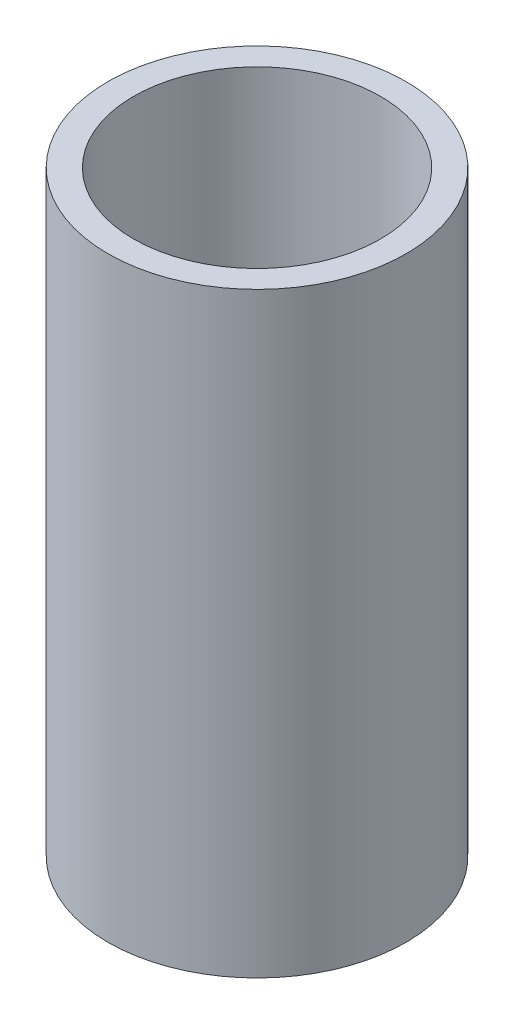
ISO-10303-21;
HEADER;
FILE_DESCRIPTION(('STEP AP214'),'2;1');
FILE_NAME('part.step','',(''),(''),'','','');
FILE_SCHEMA(('AUTOMOTIVE_DESIGN { 1 0 10303 214 1 1 1 1 }'));
ENDSEC;
DATA;
#1=APPLICATION_CONTEXT('core data for automotive mechanical design processes');
#2=APPLICATION_PROTOCOL_DEFINITION('international standard','automotive_design',2000,#1);
#3=PRODUCT_CONTEXT('',#1,'mechanical');
#4=PRODUCT('Part','Part','',(#3));
#5=PRODUCT_RELATED_PRODUCT_CATEGORY('part','',(#4));
#6=PRODUCT_DEFINITION_FORMATION('','',#4);
#7=PRODUCT_DEFINITION_CONTEXT('part definition',#1,'design');
#8=PRODUCT_DEFINITION('design','',#6,#7);
#9=PRODUCT_DEFINITION_SHAPE('','',#8);
#10=(LENGTH_UNIT() NAMED_UNIT(*) SI_UNIT(.MILLI.,.METRE.));
#11=(NAMED_UNIT(*) PLANE_ANGLE_UNIT() SI_UNIT($,.RADIAN.));
#12=(NAMED_UNIT(*) SI_UNIT($,.STERADIAN.) SOLID_ANGLE_UNIT());
#13=UNCERTAINTY_MEASURE_WITH_UNIT(LENGTH_MEASURE(1.E-05),#10,'distance_accuracy_value','');
#14=(GEOMETRIC_REPRESENTATION_CONTEXT(3) GLOBAL_UNCERTAINTY_ASSIGNED_CONTEXT((#13)) GLOBAL_UNIT_ASSIGNED_CONTEXT((#10,
#11,#12)) REPRESENTATION_CONTEXT('',''));
#15=CARTESIAN_POINT('',(0.,0.,0.));
#16=DIRECTION('',(0.,0.,1.));
#17=DIRECTION('',(1.,0.,0.));
#18=AXIS2_PLACEMENT_3D('',#15,#16,#17);
#19=CARTESIAN_POINT('',(-300.,-10.,0.));
#20=DIRECTION('',(0.,1.,0.));
#21=DIRECTION('',(0.,0.,1.));
#22=AXIS2_PLACEMENT_3D('',#19,#20,#21);
#23=CYLINDRICAL_SURFACE('',#22,17.5);
#24=CARTESIAN_POINT('',(-300.,60.,0.));
#25=DIRECTION('',(0.,1.,0.));
#26=DIRECTION('',(0.,0.,1.));
#27=AXIS2_PLACEMENT_3D('',#24,#25,#26);
#28=CIRCLE('',#27,17.5);
#29=CARTESIAN_POINT('',(-300.,60.,17.5));
#30=VERTEX_POINT('',#29);
#31=EDGE_CURVE('E47',#30,#30,#28,.T.);
#32=ORIENTED_EDGE('',*,*,#31,.F.);
#33=EDGE_LOOP('',(#32));
#34=FACE_BOUND('',#33,.T.);
#35=CARTESIAN_POINT('',(-300.,-10.,0.));
#36=DIRECTION('',(0.,1.,0.));
#37=DIRECTION('',(0.,0.,1.));
#38=AXIS2_PLACEMENT_3D('',#35,#36,#37);
#39=CIRCLE('',#38,17.5);
#40=CARTESIAN_POINT('',(-300.,-10.,17.5));
#41=VERTEX_POINT('',#40);
#42=EDGE_CURVE('E55',#41,#41,#39,.T.);
#43=ORIENTED_EDGE('',*,*,#42,.T.);
#44=EDGE_LOOP('',(#43));
#45=FACE_BOUND('',#44,.T.);
#46=ADVANCED_FACE('F41',(#34,#45),#23,.T.);
#47=CARTESIAN_POINT('',(-300.,-10.,0.));
#48=DIRECTION('',(0.,1.,0.));
#49=DIRECTION('',(0.,0.,1.));
#50=AXIS2_PLACEMENT_3D('',#47,#48,#49);
#51=PLANE('',#50);
#52=CARTESIAN_POINT('',(-300.,-10.,0.));
#53=DIRECTION('',(0.,1.,0.));
#54=DIRECTION('',(0.,0.,1.));
#55=AXIS2_PLACEMENT_3D('',#52,#53,#54);
#56=CIRCLE('',#55,14.5);
#57=CARTESIAN_POINT('',(-300.,-10.,14.5));
#58=VERTEX_POINT('',#57);
#59=EDGE_CURVE('E51',#58,#58,#56,.T.);
#60=ORIENTED_EDGE('',*,*,#59,.T.);
#61=EDGE_LOOP('',(#60));
#62=FACE_BOUND('',#61,.T.);
#63=ORIENTED_EDGE('',*,*,#42,.F.);
#64=EDGE_LOOP('',(#63));
#65=FACE_BOUND('',#64,.T.);
#66=ADVANCED_FACE('F62',(#62,#65),#51,.F.);
#67=CARTESIAN_POINT('',(-300.,60.,0.));
#68=DIRECTION('',(0.,1.,0.));
#69=DIRECTION('',(0.,0.,1.));
#70=AXIS2_PLACEMENT_3D('',#67,#68,#69);
#71=PLANE('',#70);
#72=ORIENTED_EDGE('',*,*,#31,.T.);
#73=EDGE_LOOP('',(#72));
#74=FACE_BOUND('',#73,.T.);
#75=CARTESIAN_POINT('',(-300.,60.,0.));
#76=DIRECTION('',(0.,1.,0.));
#77=DIRECTION('',(0.,0.,1.));
#78=AXIS2_PLACEMENT_3D('',#75,#76,#77);
#79=CIRCLE('',#78,14.5);
#80=CARTESIAN_POINT('',(-300.,60.,14.5));
#81=VERTEX_POINT('',#80);
#82=EDGE_CURVE('E10',#81,#81,#79,.T.);
#83=ORIENTED_EDGE('',*,*,#82,.F.);
#84=EDGE_LOOP('',(#83));
#85=FACE_BOUND('',#84,.T.);
#86=ADVANCED_FACE('F64',(#74,#85),#71,.T.);
#87=CARTESIAN_POINT('',(-300.,-10.,0.));
#88=DIRECTION('',(0.,1.,0.));
#89=DIRECTION('',(0.,0.,1.));
#90=AXIS2_PLACEMENT_3D('',#87,#88,#89);
#91=CYLINDRICAL_SURFACE('',#90,14.5);
#92=ORIENTED_EDGE('',*,*,#82,.T.);
#93=EDGE_LOOP('',(#92));
#94=FACE_BOUND('',#93,.T.);
#95=ORIENTED_EDGE('',*,*,#59,.F.);
#96=EDGE_LOOP('',(#95));
#97=FACE_BOUND('',#96,.T.);
#98=ADVANCED_FACE('F72',(#94,#97),#91,.F.);
#99=CLOSED_SHELL('',(#46,#66,#86,#98));
#100=MANIFOLD_SOLID_BREP('B2',#99);
#101=ADVANCED_BREP_SHAPE_REPRESENTATION('',(#18,#100),#14);
#102=SHAPE_DEFINITION_REPRESENTATION(#9,#101);
ENDSEC;
END-ISO-10303-21;
